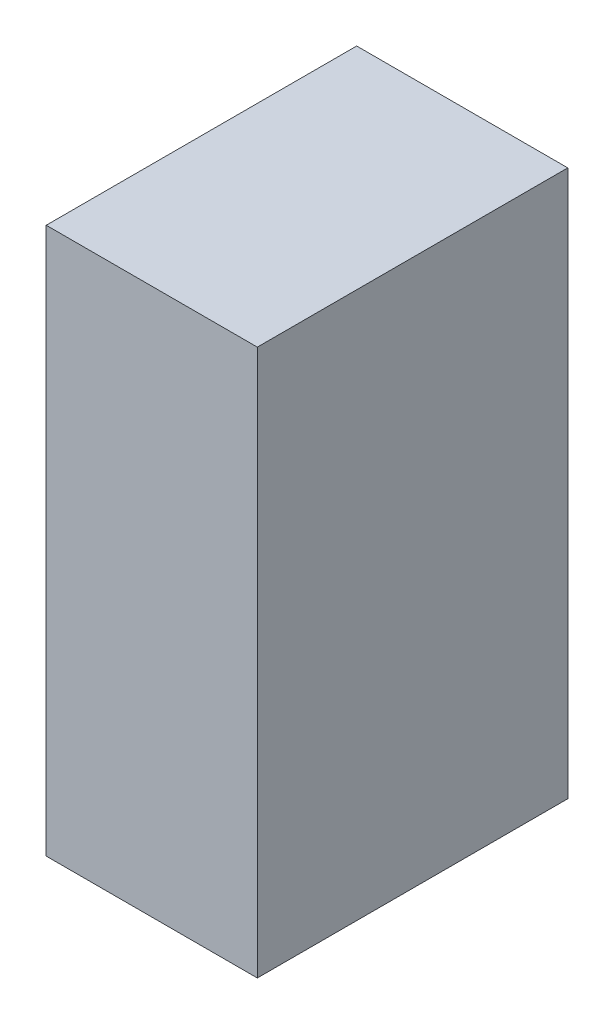
ISO-10303-21;
HEADER;
FILE_DESCRIPTION(('STEP AP214'),'2;1');
FILE_NAME('part.step','',(''),(''),'','','');
FILE_SCHEMA(('AUTOMOTIVE_DESIGN { 1 0 10303 214 1 1 1 1 }'));
ENDSEC;
DATA;
#1=APPLICATION_CONTEXT('core data for automotive mechanical design processes');
#2=APPLICATION_PROTOCOL_DEFINITION('international standard','automotive_design',2000,#1);
#3=PRODUCT_CONTEXT('',#1,'mechanical');
#4=PRODUCT('Part','Part','',(#3));
#5=PRODUCT_RELATED_PRODUCT_CATEGORY('part','',(#4));
#6=PRODUCT_DEFINITION_FORMATION('','',#4);
#7=PRODUCT_DEFINITION_CONTEXT('part definition',#1,'design');
#8=PRODUCT_DEFINITION('design','',#6,#7);
#9=PRODUCT_DEFINITION_SHAPE('','',#8);
#10=(LENGTH_UNIT() NAMED_UNIT(*) SI_UNIT(.MILLI.,.METRE.));
#11=(NAMED_UNIT(*) PLANE_ANGLE_UNIT() SI_UNIT($,.RADIAN.));
#12=(NAMED_UNIT(*) SI_UNIT($,.STERADIAN.) SOLID_ANGLE_UNIT());
#13=UNCERTAINTY_MEASURE_WITH_UNIT(LENGTH_MEASURE(1.E-05),#10,'distance_accuracy_value','');
#14=(GEOMETRIC_REPRESENTATION_CONTEXT(3) GLOBAL_UNCERTAINTY_ASSIGNED_CONTEXT((#13)) GLOBAL_UNIT_ASSIGNED_CONTEXT((#10,
#11,#12)) REPRESENTATION_CONTEXT('',''));
#15=CARTESIAN_POINT('',(0.,0.,0.));
#16=DIRECTION('',(0.,0.,1.));
#17=DIRECTION('',(1.,0.,0.));
#18=AXIS2_PLACEMENT_3D('',#15,#16,#17);
#19=CARTESIAN_POINT('',(-0.8499983,2.20000068,0.));
#20=DIRECTION('',(1.,0.,0.));
#21=DIRECTION('',(0.,0.,-1.));
#22=AXIS2_PLACEMENT_3D('',#19,#20,#21);
#23=PLANE('',#22);
#24=DIRECTION('',(0.,1.,0.));
#25=VECTOR('',#24,1.);
#26=CARTESIAN_POINT('',(-0.8499983,-2.20000068,0.));
#27=LINE('',#26,#25);
#28=CARTESIAN_POINT('',(-0.8499983,-2.20000068,0.));
#29=VERTEX_POINT('',#28);
#30=CARTESIAN_POINT('',(-0.8499983,2.20000068,0.));
#31=VERTEX_POINT('',#30);
#32=EDGE_CURVE('E53',#29,#31,#27,.T.);
#33=ORIENTED_EDGE('',*,*,#32,.F.);
#34=DIRECTION('',(0.,0.,1.));
#35=VECTOR('',#34,1.);
#36=CARTESIAN_POINT('',(-0.8499983,-2.20000068,0.));
#37=LINE('',#36,#35);
#38=CARTESIAN_POINT('',(-0.8499983,-2.20000068,2.5));
#39=VERTEX_POINT('',#38);
#40=EDGE_CURVE('E61',#29,#39,#37,.T.);
#41=ORIENTED_EDGE('',*,*,#40,.T.);
#42=DIRECTION('',(0.,1.,0.));
#43=VECTOR('',#42,1.);
#44=CARTESIAN_POINT('',(-0.8499983,-2.20000068,2.5));
#45=LINE('',#44,#43);
#46=CARTESIAN_POINT('',(-0.8499983,2.20000068,2.5));
#47=VERTEX_POINT('',#46);
#48=EDGE_CURVE('E20',#39,#47,#45,.T.);
#49=ORIENTED_EDGE('',*,*,#48,.T.);
#50=DIRECTION('',(0.,0.,-1.));
#51=VECTOR('',#50,1.);
#52=CARTESIAN_POINT('',(-0.8499983,2.20000068,0.));
#53=LINE('',#52,#51);
#54=EDGE_CURVE('E59',#47,#31,#53,.T.);
#55=ORIENTED_EDGE('',*,*,#54,.T.);
#56=EDGE_LOOP('',(#33,#41,#49,#55));
#57=FACE_BOUND('',#56,.T.);
#58=ADVANCED_FACE('F17',(#57),#23,.F.);
#59=CARTESIAN_POINT('',(0.85000084,-2.20000068,2.5));
#60=DIRECTION('',(0.,0.,-1.));
#61=DIRECTION('',(-1.,0.,0.));
#62=AXIS2_PLACEMENT_3D('',#59,#60,#61);
#63=PLANE('',#62);
#64=DIRECTION('',(1.,0.,0.));
#65=VECTOR('',#64,1.);
#66=CARTESIAN_POINT('',(0.85000084,2.20000068,2.5));
#67=LINE('',#66,#65);
#68=CARTESIAN_POINT('',(0.85000084,2.20000068,2.5));
#69=VERTEX_POINT('',#68);
#70=EDGE_CURVE('E66',#69,#47,#67,.F.);
#71=ORIENTED_EDGE('',*,*,#70,.T.);
#72=ORIENTED_EDGE('',*,*,#48,.F.);
#73=DIRECTION('',(1.,0.,0.));
#74=VECTOR('',#73,1.);
#75=CARTESIAN_POINT('',(-0.8499983,-2.20000068,2.5));
#76=LINE('',#75,#74);
#77=CARTESIAN_POINT('',(0.85000084,-2.20000068,2.5));
#78=VERTEX_POINT('',#77);
#79=EDGE_CURVE('E79',#39,#78,#76,.T.);
#80=ORIENTED_EDGE('',*,*,#79,.T.);
#81=DIRECTION('',(0.,1.,0.));
#82=VECTOR('',#81,1.);
#83=CARTESIAN_POINT('',(0.85000084,-2.20000068,2.5));
#84=LINE('',#83,#82);
#85=EDGE_CURVE('E75',#78,#69,#84,.T.);
#86=ORIENTED_EDGE('',*,*,#85,.T.);
#87=EDGE_LOOP('',(#71,#72,#80,#86));
#88=FACE_BOUND('',#87,.T.);
#89=ADVANCED_FACE('F74',(#88),#63,.F.);
#90=CARTESIAN_POINT('',(0.85000084,2.20000068,0.));
#91=DIRECTION('',(0.,-1.,0.));
#92=DIRECTION('',(0.,0.,-1.));
#93=AXIS2_PLACEMENT_3D('',#90,#91,#92);
#94=PLANE('',#93);
#95=DIRECTION('',(-1.,0.,0.));
#96=VECTOR('',#95,1.);
#97=CARTESIAN_POINT('',(0.85000084,2.20000068,0.));
#98=LINE('',#97,#96);
#99=CARTESIAN_POINT('',(0.85000084,2.20000068,0.));
#100=VERTEX_POINT('',#99);
#101=EDGE_CURVE('E71',#31,#100,#98,.F.);
#102=ORIENTED_EDGE('',*,*,#101,.F.);
#103=ORIENTED_EDGE('',*,*,#54,.F.);
#104=ORIENTED_EDGE('',*,*,#70,.F.);
#105=DIRECTION('',(0.,0.,1.));
#106=VECTOR('',#105,1.);
#107=CARTESIAN_POINT('',(0.85000084,2.20000068,0.));
#108=LINE('',#107,#106);
#109=EDGE_CURVE('E84',#69,#100,#108,.F.);
#110=ORIENTED_EDGE('',*,*,#109,.T.);
#111=EDGE_LOOP('',(#102,#103,#104,#110));
#112=FACE_BOUND('',#111,.T.);
#113=ADVANCED_FACE('F68',(#112),#94,.F.);
#114=CARTESIAN_POINT('',(0.85000084,-2.20000068,0.));
#115=DIRECTION('',(0.,0.,-1.));
#116=DIRECTION('',(-1.,0.,0.));
#117=AXIS2_PLACEMENT_3D('',#114,#115,#116);
#118=PLANE('',#117);
#119=ORIENTED_EDGE('',*,*,#32,.T.);
#120=ORIENTED_EDGE('',*,*,#101,.T.);
#121=DIRECTION('',(0.,1.,0.));
#122=VECTOR('',#121,1.);
#123=CARTESIAN_POINT('',(0.85000084,-2.20000068,0.));
#124=LINE('',#123,#122);
#125=CARTESIAN_POINT('',(0.85000084,-2.20000068,0.));
#126=VERTEX_POINT('',#125);
#127=EDGE_CURVE('E26',#100,#126,#124,.F.);
#128=ORIENTED_EDGE('',*,*,#127,.T.);
#129=DIRECTION('',(1.,0.,0.));
#130=VECTOR('',#129,1.);
#131=CARTESIAN_POINT('',(-0.8499983,-2.20000068,0.));
#132=LINE('',#131,#130);
#133=EDGE_CURVE('E34',#126,#29,#132,.F.);
#134=ORIENTED_EDGE('',*,*,#133,.T.);
#135=EDGE_LOOP('',(#119,#120,#128,#134));
#136=FACE_BOUND('',#135,.T.);
#137=ADVANCED_FACE('F88',(#136),#118,.T.);
#138=CARTESIAN_POINT('',(-0.8499983,-2.20000068,0.));
#139=DIRECTION('',(0.,1.,0.));
#140=DIRECTION('',(0.,0.,1.));
#141=AXIS2_PLACEMENT_3D('',#138,#139,#140);
#142=PLANE('',#141);
#143=ORIENTED_EDGE('',*,*,#133,.F.);
#144=DIRECTION('',(0.,0.,1.));
#145=VECTOR('',#144,1.);
#146=CARTESIAN_POINT('',(0.85000084,-2.20000068,0.));
#147=LINE('',#146,#145);
#148=EDGE_CURVE('E11',#126,#78,#147,.T.);
#149=ORIENTED_EDGE('',*,*,#148,.T.);
#150=ORIENTED_EDGE('',*,*,#79,.F.);
#151=ORIENTED_EDGE('',*,*,#40,.F.);
#152=EDGE_LOOP('',(#143,#149,#150,#151));
#153=FACE_BOUND('',#152,.T.);
#154=ADVANCED_FACE('F91',(#153),#142,.F.);
#155=CARTESIAN_POINT('',(0.85000084,-2.20000068,0.));
#156=DIRECTION('',(-1.,0.,0.));
#157=DIRECTION('',(0.,0.,1.));
#158=AXIS2_PLACEMENT_3D('',#155,#156,#157);
#159=PLANE('',#158);
#160=ORIENTED_EDGE('',*,*,#127,.F.);
#161=ORIENTED_EDGE('',*,*,#109,.F.);
#162=ORIENTED_EDGE('',*,*,#85,.F.);
#163=ORIENTED_EDGE('',*,*,#148,.F.);
#164=EDGE_LOOP('',(#160,#161,#162,#163));
#165=FACE_BOUND('',#164,.T.);
#166=ADVANCED_FACE('F90',(#165),#159,.F.);
#167=CLOSED_SHELL('',(#58,#89,#113,#137,#154,#166));
#168=MANIFOLD_SOLID_BREP('B1',#167);
#169=ADVANCED_BREP_SHAPE_REPRESENTATION('',(#18,#168),#14);
#170=SHAPE_DEFINITION_REPRESENTATION(#9,#169);
ENDSEC;
END-ISO-10303-21;
